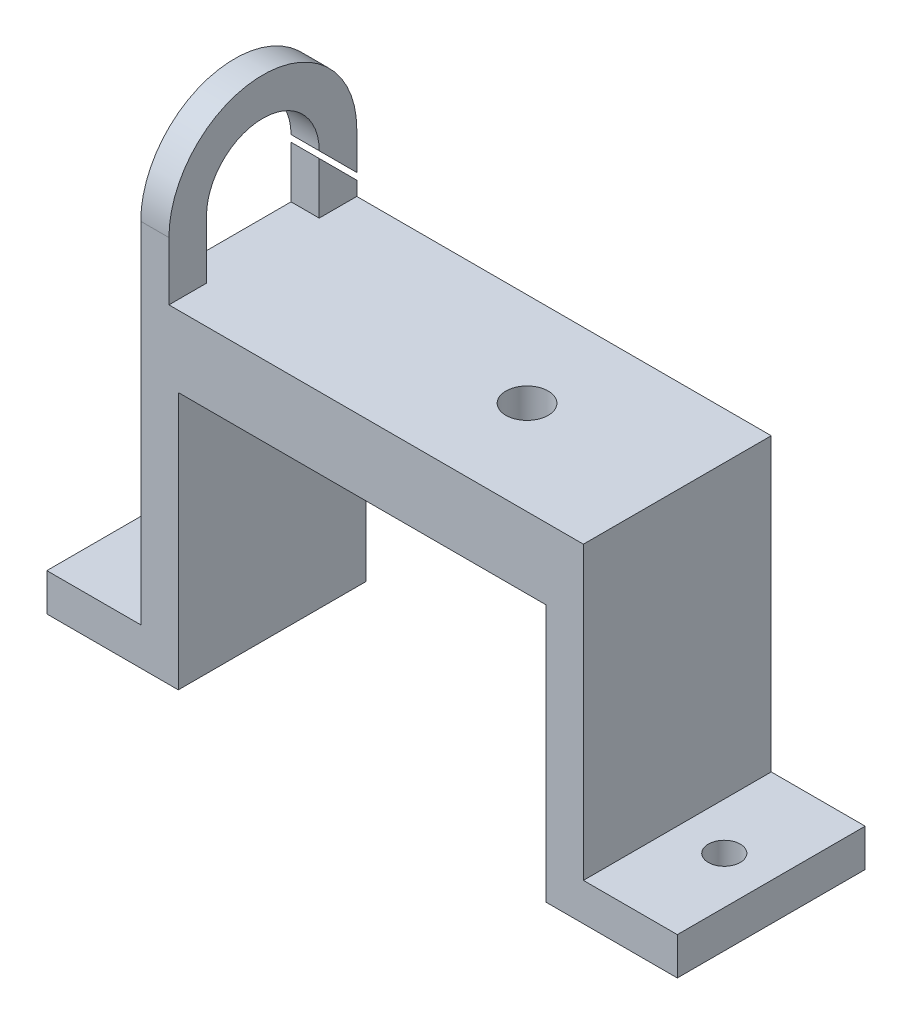
ISO-10303-21;
HEADER;
FILE_DESCRIPTION(('STEP AP214'),'2;1');
FILE_NAME('part.step','',(''),(''),'','','');
FILE_SCHEMA(('AUTOMOTIVE_DESIGN { 1 0 10303 214 1 1 1 1 }'));
ENDSEC;
DATA;
#1=APPLICATION_CONTEXT('core data for automotive mechanical design processes');
#2=APPLICATION_PROTOCOL_DEFINITION('international standard','automotive_design',2000,#1);
#3=PRODUCT_CONTEXT('',#1,'mechanical');
#4=PRODUCT('Part','Part','',(#3));
#5=PRODUCT_RELATED_PRODUCT_CATEGORY('part','',(#4));
#6=PRODUCT_DEFINITION_FORMATION('','',#4);
#7=PRODUCT_DEFINITION_CONTEXT('part definition',#1,'design');
#8=PRODUCT_DEFINITION('design','',#6,#7);
#9=PRODUCT_DEFINITION_SHAPE('','',#8);
#10=(LENGTH_UNIT() NAMED_UNIT(*) SI_UNIT(.MILLI.,.METRE.));
#11=(NAMED_UNIT(*) PLANE_ANGLE_UNIT() SI_UNIT($,.RADIAN.));
#12=(NAMED_UNIT(*) SI_UNIT($,.STERADIAN.) SOLID_ANGLE_UNIT());
#13=UNCERTAINTY_MEASURE_WITH_UNIT(LENGTH_MEASURE(1.E-05),#10,'distance_accuracy_value','');
#14=(GEOMETRIC_REPRESENTATION_CONTEXT(3) GLOBAL_UNCERTAINTY_ASSIGNED_CONTEXT((#13)) GLOBAL_UNIT_ASSIGNED_CONTEXT((#10,
#11,#12)) REPRESENTATION_CONTEXT('',''));
#15=CARTESIAN_POINT('',(0.,0.,0.));
#16=DIRECTION('',(0.,0.,1.));
#17=DIRECTION('',(1.,0.,0.));
#18=AXIS2_PLACEMENT_3D('',#15,#16,#17);
#19=CARTESIAN_POINT('',(-19.5635,0.,10.));
#20=DIRECTION('',(-1.,0.,0.));
#21=DIRECTION('',(0.,-1.,0.));
#22=AXIS2_PLACEMENT_3D('',#19,#20,#21);
#23=PLANE('',#22);
#24=DIRECTION('',(0.,1.,0.));
#25=VECTOR('',#24,1.);
#26=CARTESIAN_POINT('',(-19.5635,0.,-10.));
#27=LINE('',#26,#25);
#28=CARTESIAN_POINT('',(-19.5635,-31.,-10.));
#29=VERTEX_POINT('',#28);
#30=CARTESIAN_POINT('',(-19.5635,-3.58190647636204,-10.));
#31=VERTEX_POINT('',#30);
#32=EDGE_CURVE('E320',#29,#31,#27,.T.);
#33=ORIENTED_EDGE('',*,*,#32,.T.);
#34=CARTESIAN_POINT('',(-19.5635,-15.75,0.));
#35=DIRECTION('',(-1.,0.,0.));
#36=DIRECTION('',(0.,-1.,0.));
#37=AXIS2_PLACEMENT_3D('',#34,#35,#36);
#38=CIRCLE('',#37,15.75);
#39=CARTESIAN_POINT('',(-19.5635,-3.58190647636204,10.));
#40=VERTEX_POINT('',#39);
#41=EDGE_CURVE('E68',#40,#31,#38,.T.);
#42=ORIENTED_EDGE('',*,*,#41,.F.);
#43=DIRECTION('',(0.,1.,0.));
#44=VECTOR('',#43,1.);
#45=CARTESIAN_POINT('',(-19.5635,0.,10.));
#46=LINE('',#45,#44);
#47=CARTESIAN_POINT('',(-19.5635,-31.,10.));
#48=VERTEX_POINT('',#47);
#49=EDGE_CURVE('E295',#48,#40,#46,.T.);
#50=ORIENTED_EDGE('',*,*,#49,.F.);
#51=DIRECTION('',(0.,0.,-1.));
#52=VECTOR('',#51,1.);
#53=CARTESIAN_POINT('',(-19.5635,-31.,10.));
#54=LINE('',#53,#52);
#55=EDGE_CURVE('E53',#48,#29,#54,.T.);
#56=ORIENTED_EDGE('',*,*,#55,.T.);
#57=EDGE_LOOP('',(#33,#42,#50,#56));
#58=FACE_BOUND('',#57,.T.);
#59=ADVANCED_FACE('F39',(#58),#23,.F.);
#60=CARTESIAN_POINT('',(19.5635,0.,10.));
#61=DIRECTION('',(1.,0.,0.));
#62=DIRECTION('',(0.,1.,0.));
#63=AXIS2_PLACEMENT_3D('',#60,#61,#62);
#64=PLANE('',#63);
#65=CARTESIAN_POINT('',(19.5635,-15.75,0.));
#66=DIRECTION('',(1.,0.,0.));
#67=DIRECTION('',(0.,1.,0.));
#68=AXIS2_PLACEMENT_3D('',#65,#66,#67);
#69=CIRCLE('',#68,15.75);
#70=CARTESIAN_POINT('',(19.5635,-3.58190647636204,10.));
#71=VERTEX_POINT('',#70);
#72=CARTESIAN_POINT('',(19.5635,-3.58190647636204,-10.));
#73=VERTEX_POINT('',#72);
#74=EDGE_CURVE('E285',#71,#73,#69,.F.);
#75=ORIENTED_EDGE('',*,*,#74,.T.);
#76=DIRECTION('',(0.,-1.,0.));
#77=VECTOR('',#76,1.);
#78=CARTESIAN_POINT('',(19.5635,0.,-10.));
#79=LINE('',#78,#77);
#80=CARTESIAN_POINT('',(19.5635,-31.,-10.));
#81=VERTEX_POINT('',#80);
#82=EDGE_CURVE('E322',#73,#81,#79,.T.);
#83=ORIENTED_EDGE('',*,*,#82,.T.);
#84=DIRECTION('',(0.,0.,-1.));
#85=VECTOR('',#84,1.);
#86=CARTESIAN_POINT('',(19.5635,-31.,10.));
#87=LINE('',#86,#85);
#88=CARTESIAN_POINT('',(19.5635,-31.,10.));
#89=VERTEX_POINT('',#88);
#90=EDGE_CURVE('E356',#89,#81,#87,.T.);
#91=ORIENTED_EDGE('',*,*,#90,.F.);
#92=DIRECTION('',(0.,-1.,0.));
#93=VECTOR('',#92,1.);
#94=CARTESIAN_POINT('',(19.5635,0.,10.));
#95=LINE('',#94,#93);
#96=EDGE_CURVE('E298',#71,#89,#95,.T.);
#97=ORIENTED_EDGE('',*,*,#96,.F.);
#98=EDGE_LOOP('',(#75,#83,#91,#97));
#99=FACE_BOUND('',#98,.T.);
#100=ADVANCED_FACE('F377',(#99),#64,.F.);
#101=CARTESIAN_POINT('',(-33.5635,-31.,10.));
#102=DIRECTION('',(1.,0.,0.));
#103=DIRECTION('',(0.,0.,-1.));
#104=AXIS2_PLACEMENT_3D('',#101,#102,#103);
#105=PLANE('',#104);
#106=DIRECTION('',(0.,-1.,0.));
#107=VECTOR('',#106,1.);
#108=CARTESIAN_POINT('',(-33.5635,-31.,-10.));
#109=LINE('',#108,#107);
#110=CARTESIAN_POINT('',(-33.5635,-27.,-10.));
#111=VERTEX_POINT('',#110);
#112=CARTESIAN_POINT('',(-33.5635,-31.,-10.));
#113=VERTEX_POINT('',#112);
#114=EDGE_CURVE('E287',#111,#113,#109,.T.);
#115=ORIENTED_EDGE('',*,*,#114,.T.);
#116=DIRECTION('',(0.,0.,-1.));
#117=VECTOR('',#116,1.);
#118=CARTESIAN_POINT('',(-33.5635,-31.,10.));
#119=LINE('',#118,#117);
#120=CARTESIAN_POINT('',(-33.5635,-31.,10.));
#121=VERTEX_POINT('',#120);
#122=EDGE_CURVE('E11',#121,#113,#119,.T.);
#123=ORIENTED_EDGE('',*,*,#122,.F.);
#124=DIRECTION('',(0.,-1.,0.));
#125=VECTOR('',#124,1.);
#126=CARTESIAN_POINT('',(-33.5635,-31.,10.));
#127=LINE('',#126,#125);
#128=CARTESIAN_POINT('',(-33.5635,-27.,10.));
#129=VERTEX_POINT('',#128);
#130=EDGE_CURVE('E289',#129,#121,#127,.T.);
#131=ORIENTED_EDGE('',*,*,#130,.F.);
#132=DIRECTION('',(0.,0.,-1.));
#133=VECTOR('',#132,1.);
#134=CARTESIAN_POINT('',(-33.5635,-27.,10.));
#135=LINE('',#134,#133);
#136=EDGE_CURVE('E315',#129,#111,#135,.T.);
#137=ORIENTED_EDGE('',*,*,#136,.T.);
#138=EDGE_LOOP('',(#115,#123,#131,#137));
#139=FACE_BOUND('',#138,.T.);
#140=ADVANCED_FACE('F41',(#139),#105,.F.);
#141=CARTESIAN_POINT('',(-19.5635,-31.,10.));
#142=DIRECTION('',(0.,1.,0.));
#143=DIRECTION('',(-1.,0.,0.));
#144=AXIS2_PLACEMENT_3D('',#141,#142,#143);
#145=PLANE('',#144);
#146=CARTESIAN_POINT('',(-28.5635,-31.,0.));
#147=DIRECTION('',(0.,1.,0.));
#148=DIRECTION('',(-1.,0.,0.));
#149=AXIS2_PLACEMENT_3D('',#146,#147,#148);
#150=CIRCLE('',#149,1.69999999999999);
#151=CARTESIAN_POINT('',(-30.2635,-31.,0.));
#152=VERTEX_POINT('',#151);
#153=EDGE_CURVE('E277',#152,#152,#150,.T.);
#154=ORIENTED_EDGE('',*,*,#153,.T.);
#155=EDGE_LOOP('',(#154));
#156=FACE_BOUND('',#155,.T.);
#157=DIRECTION('',(1.,0.,0.));
#158=VECTOR('',#157,1.);
#159=CARTESIAN_POINT('',(-19.5635,-31.,-10.));
#160=LINE('',#159,#158);
#161=EDGE_CURVE('E318',#113,#29,#160,.T.);
#162=ORIENTED_EDGE('',*,*,#161,.T.);
#163=ORIENTED_EDGE('',*,*,#55,.F.);
#164=DIRECTION('',(1.,0.,0.));
#165=VECTOR('',#164,1.);
#166=CARTESIAN_POINT('',(-19.5635,-31.,10.));
#167=LINE('',#166,#165);
#168=EDGE_CURVE('E292',#121,#48,#167,.T.);
#169=ORIENTED_EDGE('',*,*,#168,.F.);
#170=ORIENTED_EDGE('',*,*,#122,.T.);
#171=EDGE_LOOP('',(#162,#163,#169,#170));
#172=FACE_BOUND('',#171,.T.);
#173=ADVANCED_FACE('F431',(#156,#172),#145,.F.);
#174=CARTESIAN_POINT('',(33.5635,-31.,10.));
#175=DIRECTION('',(0.,1.,0.));
#176=DIRECTION('',(-1.,0.,0.));
#177=AXIS2_PLACEMENT_3D('',#174,#175,#176);
#178=PLANE('',#177);
#179=CARTESIAN_POINT('',(28.5635,-31.,0.));
#180=DIRECTION('',(0.,1.,0.));
#181=DIRECTION('',(-1.,0.,0.));
#182=AXIS2_PLACEMENT_3D('',#179,#180,#181);
#183=CIRCLE('',#182,1.69999999999999);
#184=CARTESIAN_POINT('',(26.8635,-31.,0.));
#185=VERTEX_POINT('',#184);
#186=EDGE_CURVE('E271',#185,#185,#183,.T.);
#187=ORIENTED_EDGE('',*,*,#186,.T.);
#188=EDGE_LOOP('',(#187));
#189=FACE_BOUND('',#188,.T.);
#190=DIRECTION('',(1.,0.,0.));
#191=VECTOR('',#190,1.);
#192=CARTESIAN_POINT('',(33.5635,-31.,-10.));
#193=LINE('',#192,#191);
#194=CARTESIAN_POINT('',(33.5635,-31.,-10.));
#195=VERTEX_POINT('',#194);
#196=EDGE_CURVE('E324',#81,#195,#193,.T.);
#197=ORIENTED_EDGE('',*,*,#196,.T.);
#198=DIRECTION('',(0.,0.,-1.));
#199=VECTOR('',#198,1.);
#200=CARTESIAN_POINT('',(33.5635,-31.,10.));
#201=LINE('',#200,#199);
#202=CARTESIAN_POINT('',(33.5635,-31.,10.));
#203=VERTEX_POINT('',#202);
#204=EDGE_CURVE('E353',#203,#195,#201,.T.);
#205=ORIENTED_EDGE('',*,*,#204,.F.);
#206=DIRECTION('',(1.,0.,0.));
#207=VECTOR('',#206,1.);
#208=CARTESIAN_POINT('',(33.5635,-31.,10.));
#209=LINE('',#208,#207);
#210=EDGE_CURVE('E300',#89,#203,#209,.T.);
#211=ORIENTED_EDGE('',*,*,#210,.F.);
#212=ORIENTED_EDGE('',*,*,#90,.T.);
#213=EDGE_LOOP('',(#197,#205,#211,#212));
#214=FACE_BOUND('',#213,.T.);
#215=ADVANCED_FACE('F381',(#189,#214),#178,.F.);
#216=CARTESIAN_POINT('',(33.5635,-27.,10.));
#217=DIRECTION('',(-1.,0.,0.));
#218=DIRECTION('',(0.,0.,1.));
#219=AXIS2_PLACEMENT_3D('',#216,#217,#218);
#220=PLANE('',#219);
#221=DIRECTION('',(0.,1.,0.));
#222=VECTOR('',#221,1.);
#223=CARTESIAN_POINT('',(33.5635,-27.,-10.));
#224=LINE('',#223,#222);
#225=CARTESIAN_POINT('',(33.5635,-27.,-10.));
#226=VERTEX_POINT('',#225);
#227=EDGE_CURVE('E326',#195,#226,#224,.T.);
#228=ORIENTED_EDGE('',*,*,#227,.T.);
#229=DIRECTION('',(0.,0.,-1.));
#230=VECTOR('',#229,1.);
#231=CARTESIAN_POINT('',(33.5635,-27.,10.));
#232=LINE('',#231,#230);
#233=CARTESIAN_POINT('',(33.5635,-27.,10.));
#234=VERTEX_POINT('',#233);
#235=EDGE_CURVE('E350',#234,#226,#232,.T.);
#236=ORIENTED_EDGE('',*,*,#235,.F.);
#237=DIRECTION('',(0.,1.,0.));
#238=VECTOR('',#237,1.);
#239=CARTESIAN_POINT('',(33.5635,-27.,10.));
#240=LINE('',#239,#238);
#241=EDGE_CURVE('E302',#203,#234,#240,.T.);
#242=ORIENTED_EDGE('',*,*,#241,.F.);
#243=ORIENTED_EDGE('',*,*,#204,.T.);
#244=EDGE_LOOP('',(#228,#236,#242,#243));
#245=FACE_BOUND('',#244,.T.);
#246=ADVANCED_FACE('F387',(#245),#220,.F.);
#247=CARTESIAN_POINT('',(23.5635,-27.,10.));
#248=DIRECTION('',(0.,-1.,0.));
#249=DIRECTION('',(0.,0.,-1.));
#250=AXIS2_PLACEMENT_3D('',#247,#248,#249);
#251=PLANE('',#250);
#252=CARTESIAN_POINT('',(28.5635,-27.,0.));
#253=DIRECTION('',(0.,1.,0.));
#254=DIRECTION('',(0.,0.,1.));
#255=AXIS2_PLACEMENT_3D('',#252,#253,#254);
#256=CIRCLE('',#255,1.69999999999999);
#257=CARTESIAN_POINT('',(28.5635,-27.,1.69999999999999));
#258=VERTEX_POINT('',#257);
#259=EDGE_CURVE('E268',#258,#258,#256,.T.);
#260=ORIENTED_EDGE('',*,*,#259,.F.);
#261=EDGE_LOOP('',(#260));
#262=FACE_BOUND('',#261,.T.);
#263=DIRECTION('',(-1.,0.,0.));
#264=VECTOR('',#263,1.);
#265=CARTESIAN_POINT('',(23.5635,-27.,-10.));
#266=LINE('',#265,#264);
#267=CARTESIAN_POINT('',(23.5635,-27.,-10.));
#268=VERTEX_POINT('',#267);
#269=EDGE_CURVE('E328',#226,#268,#266,.T.);
#270=ORIENTED_EDGE('',*,*,#269,.T.);
#271=DIRECTION('',(0.,0.,-1.));
#272=VECTOR('',#271,1.);
#273=CARTESIAN_POINT('',(23.5635,-27.,10.));
#274=LINE('',#273,#272);
#275=CARTESIAN_POINT('',(23.5635,-27.,10.));
#276=VERTEX_POINT('',#275);
#277=EDGE_CURVE('E347',#276,#268,#274,.T.);
#278=ORIENTED_EDGE('',*,*,#277,.F.);
#279=DIRECTION('',(-1.,0.,0.));
#280=VECTOR('',#279,1.);
#281=CARTESIAN_POINT('',(23.5635,-27.,10.));
#282=LINE('',#281,#280);
#283=EDGE_CURVE('E304',#234,#276,#282,.T.);
#284=ORIENTED_EDGE('',*,*,#283,.F.);
#285=ORIENTED_EDGE('',*,*,#235,.T.);
#286=EDGE_LOOP('',(#270,#278,#284,#285));
#287=FACE_BOUND('',#286,.T.);
#288=ADVANCED_FACE('F391',(#262,#287),#251,.F.);
#289=CARTESIAN_POINT('',(23.5635,4.,10.));
#290=DIRECTION('',(-1.,0.,0.));
#291=DIRECTION('',(0.,-1.,0.));
#292=AXIS2_PLACEMENT_3D('',#289,#290,#291);
#293=PLANE('',#292);
#294=DIRECTION('',(0.,1.,0.));
#295=VECTOR('',#294,1.);
#296=CARTESIAN_POINT('',(23.5635,4.,-10.));
#297=LINE('',#296,#295);
#298=CARTESIAN_POINT('',(23.5635,4.,-10.));
#299=VERTEX_POINT('',#298);
#300=EDGE_CURVE('E330',#268,#299,#297,.T.);
#301=ORIENTED_EDGE('',*,*,#300,.T.);
#302=DIRECTION('',(0.,0.,-1.));
#303=VECTOR('',#302,1.);
#304=CARTESIAN_POINT('',(23.5635,4.,10.));
#305=LINE('',#304,#303);
#306=CARTESIAN_POINT('',(23.5635,4.,10.));
#307=VERTEX_POINT('',#306);
#308=EDGE_CURVE('E344',#307,#299,#305,.T.);
#309=ORIENTED_EDGE('',*,*,#308,.F.);
#310=DIRECTION('',(0.,1.,0.));
#311=VECTOR('',#310,1.);
#312=CARTESIAN_POINT('',(23.5635,4.,10.));
#313=LINE('',#312,#311);
#314=EDGE_CURVE('E306',#276,#307,#313,.T.);
#315=ORIENTED_EDGE('',*,*,#314,.F.);
#316=ORIENTED_EDGE('',*,*,#277,.T.);
#317=EDGE_LOOP('',(#301,#309,#315,#316));
#318=FACE_BOUND('',#317,.T.);
#319=ADVANCED_FACE('F396',(#318),#293,.F.);
#320=CARTESIAN_POINT('',(-23.5635,4.,10.));
#321=DIRECTION('',(0.,-1.,0.));
#322=DIRECTION('',(0.,0.,-1.));
#323=AXIS2_PLACEMENT_3D('',#320,#321,#322);
#324=PLANE('',#323);
#325=CARTESIAN_POINT('',(7.5635,4.,0.));
#326=DIRECTION('',(0.,1.,0.));
#327=DIRECTION('',(0.,0.,1.));
#328=AXIS2_PLACEMENT_3D('',#325,#326,#327);
#329=CIRCLE('',#328,2.24999999999999);
#330=CARTESIAN_POINT('',(7.5635,4.,2.24999999999999));
#331=VERTEX_POINT('',#330);
#332=EDGE_CURVE('E261',#331,#331,#329,.T.);
#333=ORIENTED_EDGE('',*,*,#332,.F.);
#334=EDGE_LOOP('',(#333));
#335=FACE_BOUND('',#334,.T.);
#336=DIRECTION('',(0.,0.,-1.));
#337=VECTOR('',#336,1.);
#338=CARTESIAN_POINT('',(-23.5635,4.,10.));
#339=LINE('',#338,#337);
#340=CARTESIAN_POINT('',(-23.5635,4.,6.));
#341=VERTEX_POINT('',#340);
#342=CARTESIAN_POINT('',(-23.5635,4.,-6.));
#343=VERTEX_POINT('',#342);
#344=EDGE_CURVE('E60',#341,#343,#339,.T.);
#345=ORIENTED_EDGE('',*,*,#344,.F.);
#346=DIRECTION('',(-1.,0.,0.));
#347=VECTOR('',#346,1.);
#348=CARTESIAN_POINT('',(-20.5635,4.,6.));
#349=LINE('',#348,#347);
#350=CARTESIAN_POINT('',(-20.5635,4.,6.));
#351=VERTEX_POINT('',#350);
#352=EDGE_CURVE('E206',#351,#341,#349,.T.);
#353=ORIENTED_EDGE('',*,*,#352,.F.);
#354=DIRECTION('',(0.,0.,1.));
#355=VECTOR('',#354,1.);
#356=CARTESIAN_POINT('',(-20.5635,4.,10.));
#357=LINE('',#356,#355);
#358=CARTESIAN_POINT('',(-20.5635,4.,10.));
#359=VERTEX_POINT('',#358);
#360=EDGE_CURVE('E219',#351,#359,#357,.T.);
#361=ORIENTED_EDGE('',*,*,#360,.T.);
#362=DIRECTION('',(-1.,0.,0.));
#363=VECTOR('',#362,1.);
#364=CARTESIAN_POINT('',(-23.5635,4.,10.));
#365=LINE('',#364,#363);
#366=EDGE_CURVE('E308',#307,#359,#365,.T.);
#367=ORIENTED_EDGE('',*,*,#366,.F.);
#368=ORIENTED_EDGE('',*,*,#308,.T.);
#369=DIRECTION('',(-1.,0.,0.));
#370=VECTOR('',#369,1.);
#371=CARTESIAN_POINT('',(-23.5635,4.,-10.));
#372=LINE('',#371,#370);
#373=CARTESIAN_POINT('',(-20.5635,4.,-10.));
#374=VERTEX_POINT('',#373);
#375=EDGE_CURVE('E332',#299,#374,#372,.T.);
#376=ORIENTED_EDGE('',*,*,#375,.T.);
#377=DIRECTION('',(0.,0.,1.));
#378=VECTOR('',#377,1.);
#379=CARTESIAN_POINT('',(-20.5635,4.,-6.));
#380=LINE('',#379,#378);
#381=CARTESIAN_POINT('',(-20.5635,4.,-6.));
#382=VERTEX_POINT('',#381);
#383=EDGE_CURVE('E241',#374,#382,#380,.T.);
#384=ORIENTED_EDGE('',*,*,#383,.T.);
#385=DIRECTION('',(-1.,0.,0.));
#386=VECTOR('',#385,1.);
#387=CARTESIAN_POINT('',(-20.5635,4.,-6.));
#388=LINE('',#387,#386);
#389=EDGE_CURVE('E254',#382,#343,#388,.T.);
#390=ORIENTED_EDGE('',*,*,#389,.T.);
#391=EDGE_LOOP('',(#345,#353,#361,#367,#368,#376,#384,#390));
#392=FACE_BOUND('',#391,.T.);
#393=ADVANCED_FACE('F400',(#335,#392),#324,.F.);
#394=CARTESIAN_POINT('',(-23.5635,-27.,10.));
#395=DIRECTION('',(1.,0.,0.));
#396=DIRECTION('',(0.,1.,0.));
#397=AXIS2_PLACEMENT_3D('',#394,#395,#396);
#398=PLANE('',#397);
#399=DIRECTION('',(0.,-1.,0.));
#400=VECTOR('',#399,1.);
#401=CARTESIAN_POINT('',(-23.5635,-27.,-10.));
#402=LINE('',#401,#400);
#403=CARTESIAN_POINT('',(-23.5635,5.5,-10.));
#404=VERTEX_POINT('',#403);
#405=CARTESIAN_POINT('',(-23.5635,-27.,-10.));
#406=VERTEX_POINT('',#405);
#407=EDGE_CURVE('E335',#404,#406,#402,.T.);
#408=ORIENTED_EDGE('',*,*,#407,.T.);
#409=DIRECTION('',(0.,0.,-1.));
#410=VECTOR('',#409,1.);
#411=CARTESIAN_POINT('',(-23.5635,-27.,10.));
#412=LINE('',#411,#410);
#413=CARTESIAN_POINT('',(-23.5635,-27.,10.));
#414=VERTEX_POINT('',#413);
#415=EDGE_CURVE('E340',#414,#406,#412,.T.);
#416=ORIENTED_EDGE('',*,*,#415,.F.);
#417=DIRECTION('',(0.,-1.,0.));
#418=VECTOR('',#417,1.);
#419=CARTESIAN_POINT('',(-23.5635,-27.,10.));
#420=LINE('',#419,#418);
#421=CARTESIAN_POINT('',(-23.5635,10.2071067811866,9.99999999999999));
#422=VERTEX_POINT('',#421);
#423=EDGE_CURVE('E311',#422,#414,#420,.T.);
#424=ORIENTED_EDGE('',*,*,#423,.F.);
#425=CARTESIAN_POINT('',(-23.5635,10.2071067811866,0.));
#426=DIRECTION('',(-1.,0.,0.));
#427=DIRECTION('',(0.,-1.,0.));
#428=AXIS2_PLACEMENT_3D('',#425,#426,#427);
#429=CIRCLE('',#428,9.99999999999999);
#430=CARTESIAN_POINT('',(-23.5635,10.2071067811866,-9.99999999999999));
#431=VERTEX_POINT('',#430);
#432=EDGE_CURVE('E208',#422,#431,#429,.T.);
#433=ORIENTED_EDGE('',*,*,#432,.T.);
#434=DIRECTION('',(0.,-1.,0.));
#435=VECTOR('',#434,1.);
#436=CARTESIAN_POINT('',(-23.5635,6.20710678118655,-10.));
#437=LINE('',#436,#435);
#438=CARTESIAN_POINT('',(-23.5635,6.20710678118655,-10.));
#439=VERTEX_POINT('',#438);
#440=EDGE_CURVE('E217',#431,#439,#437,.T.);
#441=ORIENTED_EDGE('',*,*,#440,.T.);
#442=DIRECTION('',(0.,0.707106781186551,0.707106781186544));
#443=VECTOR('',#442,1.);
#444=CARTESIAN_POINT('',(-23.5635,6.20710678118655,-10.));
#445=LINE('',#444,#443);
#446=CARTESIAN_POINT('',(-23.5635,10.2071067811866,-6.));
#447=VERTEX_POINT('',#446);
#448=EDGE_CURVE('E214',#439,#447,#445,.T.);
#449=ORIENTED_EDGE('',*,*,#448,.T.);
#450=CARTESIAN_POINT('',(-23.5635,10.2071067811866,0.));
#451=DIRECTION('',(1.,0.,0.));
#452=DIRECTION('',(0.,-1.,0.));
#453=AXIS2_PLACEMENT_3D('',#450,#451,#452);
#454=CIRCLE('',#453,6.);
#455=CARTESIAN_POINT('',(-23.5635,10.2071067811866,6.));
#456=VERTEX_POINT('',#455);
#457=EDGE_CURVE('E195',#447,#456,#454,.T.);
#458=ORIENTED_EDGE('',*,*,#457,.T.);
#459=DIRECTION('',(0.,-1.,0.));
#460=VECTOR('',#459,1.);
#461=CARTESIAN_POINT('',(-23.5635,4.,6.));
#462=LINE('',#461,#460);
#463=EDGE_CURVE('E203',#456,#341,#462,.T.);
#464=ORIENTED_EDGE('',*,*,#463,.T.);
#465=ORIENTED_EDGE('',*,*,#344,.T.);
#466=DIRECTION('',(0.,1.,0.));
#467=VECTOR('',#466,1.);
#468=CARTESIAN_POINT('',(-23.5635,9.50000000000004,-6.));
#469=LINE('',#468,#467);
#470=CARTESIAN_POINT('',(-23.5635,9.50000000000004,-6.));
#471=VERTEX_POINT('',#470);
#472=EDGE_CURVE('E207',#343,#471,#469,.T.);
#473=ORIENTED_EDGE('',*,*,#472,.T.);
#474=DIRECTION('',(0.,-0.707106781186552,-0.707106781186544));
#475=VECTOR('',#474,1.);
#476=CARTESIAN_POINT('',(-23.5635,5.5,-10.));
#477=LINE('',#476,#475);
#478=EDGE_CURVE('E245',#471,#404,#477,.T.);
#479=ORIENTED_EDGE('',*,*,#478,.T.);
#480=EDGE_LOOP('',(#408,#416,#424,#433,#441,#449,#458,#464,#465,#473,#479));
#481=FACE_BOUND('',#480,.T.);
#482=ADVANCED_FACE('F211',(#481),#398,.F.);
#483=CARTESIAN_POINT('',(-33.5635,-27.,10.));
#484=DIRECTION('',(0.,-1.,0.));
#485=DIRECTION('',(0.,0.,-1.));
#486=AXIS2_PLACEMENT_3D('',#483,#484,#485);
#487=PLANE('',#486);
#488=CARTESIAN_POINT('',(-28.5635,-27.,0.));
#489=DIRECTION('',(0.,1.,0.));
#490=DIRECTION('',(0.,0.,1.));
#491=AXIS2_PLACEMENT_3D('',#488,#489,#490);
#492=CIRCLE('',#491,1.69999999999999);
#493=CARTESIAN_POINT('',(-28.5635,-27.,1.69999999999999));
#494=VERTEX_POINT('',#493);
#495=EDGE_CURVE('E274',#494,#494,#492,.T.);
#496=ORIENTED_EDGE('',*,*,#495,.F.);
#497=EDGE_LOOP('',(#496));
#498=FACE_BOUND('',#497,.T.);
#499=DIRECTION('',(-1.,0.,0.));
#500=VECTOR('',#499,1.);
#501=CARTESIAN_POINT('',(-33.5635,-27.,-10.));
#502=LINE('',#501,#500);
#503=EDGE_CURVE('E293',#406,#111,#502,.T.);
#504=ORIENTED_EDGE('',*,*,#503,.T.);
#505=ORIENTED_EDGE('',*,*,#136,.F.);
#506=DIRECTION('',(-1.,0.,0.));
#507=VECTOR('',#506,1.);
#508=CARTESIAN_POINT('',(-33.5635,-27.,10.));
#509=LINE('',#508,#507);
#510=EDGE_CURVE('E313',#414,#129,#509,.T.);
#511=ORIENTED_EDGE('',*,*,#510,.F.);
#512=ORIENTED_EDGE('',*,*,#415,.T.);
#513=EDGE_LOOP('',(#504,#505,#511,#512));
#514=FACE_BOUND('',#513,.T.);
#515=ADVANCED_FACE('F428',(#498,#514),#487,.F.);
#516=CARTESIAN_POINT('',(0.,0.,10.));
#517=DIRECTION('',(0.,0.,-1.));
#518=DIRECTION('',(-1.,0.,0.));
#519=AXIS2_PLACEMENT_3D('',#516,#517,#518);
#520=PLANE('',#519);
#521=ORIENTED_EDGE('',*,*,#49,.T.);
#522=DIRECTION('',(-1.,0.,0.));
#523=VECTOR('',#522,1.);
#524=CARTESIAN_POINT('',(30.1856492178092,-3.58190647636204,10.));
#525=LINE('',#524,#523);
#526=EDGE_CURVE('E283',#71,#40,#525,.T.);
#527=ORIENTED_EDGE('',*,*,#526,.F.);
#528=ORIENTED_EDGE('',*,*,#96,.T.);
#529=ORIENTED_EDGE('',*,*,#210,.T.);
#530=ORIENTED_EDGE('',*,*,#241,.T.);
#531=ORIENTED_EDGE('',*,*,#283,.T.);
#532=ORIENTED_EDGE('',*,*,#314,.T.);
#533=ORIENTED_EDGE('',*,*,#366,.T.);
#534=DIRECTION('',(0.,1.,0.));
#535=VECTOR('',#534,1.);
#536=CARTESIAN_POINT('',(-20.5635,4.,10.));
#537=LINE('',#536,#535);
#538=CARTESIAN_POINT('',(-20.5635,10.2071067811866,9.99999999999999));
#539=VERTEX_POINT('',#538);
#540=EDGE_CURVE('E236',#359,#539,#537,.T.);
#541=ORIENTED_EDGE('',*,*,#540,.T.);
#542=DIRECTION('',(-1.,0.,0.));
#543=VECTOR('',#542,1.);
#544=CARTESIAN_POINT('',(-20.5635,10.2071067811866,9.99999999999999));
#545=LINE('',#544,#543);
#546=EDGE_CURVE('E412',#539,#422,#545,.T.);
#547=ORIENTED_EDGE('',*,*,#546,.T.);
#548=ORIENTED_EDGE('',*,*,#423,.T.);
#549=ORIENTED_EDGE('',*,*,#510,.T.);
#550=ORIENTED_EDGE('',*,*,#130,.T.);
#551=ORIENTED_EDGE('',*,*,#168,.T.);
#552=EDGE_LOOP('',(#521,#527,#528,#529,#530,#531,#532,#533,#541,#547,#548,#549,#550,#551));
#553=FACE_BOUND('',#552,.T.);
#554=ADVANCED_FACE('F375',(#553),#520,.F.);
#555=CARTESIAN_POINT('',(0.,0.,-10.));
#556=DIRECTION('',(0.,0.,-1.));
#557=DIRECTION('',(-1.,0.,0.));
#558=AXIS2_PLACEMENT_3D('',#555,#556,#557);
#559=PLANE('',#558);
#560=DIRECTION('',(-1.,0.,0.));
#561=VECTOR('',#560,1.);
#562=CARTESIAN_POINT('',(30.1856492178092,-3.58190647636204,-10.));
#563=LINE('',#562,#561);
#564=EDGE_CURVE('E280',#73,#31,#563,.T.);
#565=ORIENTED_EDGE('',*,*,#564,.T.);
#566=ORIENTED_EDGE('',*,*,#32,.F.);
#567=ORIENTED_EDGE('',*,*,#161,.F.);
#568=ORIENTED_EDGE('',*,*,#114,.F.);
#569=ORIENTED_EDGE('',*,*,#503,.F.);
#570=ORIENTED_EDGE('',*,*,#407,.F.);
#571=DIRECTION('',(-1.,0.,0.));
#572=VECTOR('',#571,1.);
#573=CARTESIAN_POINT('',(-20.5635,5.5,-10.));
#574=LINE('',#573,#572);
#575=CARTESIAN_POINT('',(-20.5635,5.5,-10.));
#576=VERTEX_POINT('',#575);
#577=EDGE_CURVE('E258',#576,#404,#574,.T.);
#578=ORIENTED_EDGE('',*,*,#577,.F.);
#579=DIRECTION('',(0.,-1.,0.));
#580=VECTOR('',#579,1.);
#581=CARTESIAN_POINT('',(-20.5635,4.,-10.));
#582=LINE('',#581,#580);
#583=EDGE_CURVE('E251',#576,#374,#582,.T.);
#584=ORIENTED_EDGE('',*,*,#583,.T.);
#585=ORIENTED_EDGE('',*,*,#375,.F.);
#586=ORIENTED_EDGE('',*,*,#300,.F.);
#587=ORIENTED_EDGE('',*,*,#269,.F.);
#588=ORIENTED_EDGE('',*,*,#227,.F.);
#589=ORIENTED_EDGE('',*,*,#196,.F.);
#590=ORIENTED_EDGE('',*,*,#82,.F.);
#591=EDGE_LOOP('',(#565,#566,#567,#568,#569,#570,#578,#584,#585,#586,#587,#588,#589,#590));
#592=FACE_BOUND('',#591,.T.);
#593=ADVANCED_FACE('F366',(#592),#559,.T.);
#594=CARTESIAN_POINT('',(30.1856492178092,-15.75,0.));
#595=DIRECTION('',(-1.,0.,0.));
#596=DIRECTION('',(0.,0.,1.));
#597=AXIS2_PLACEMENT_3D('',#594,#595,#596);
#598=CYLINDRICAL_SURFACE('',#597,15.75);
#599=CARTESIAN_POINT('',(7.5635,-0.161542731880104,2.24999999999999));
#600=CARTESIAN_POINT('',(7.68918969264549,-0.161540710713376,2.24999475880481));
#601=CARTESIAN_POINT('',(7.81495405186889,-0.160006140302906,2.23943247570239));
#602=CARTESIAN_POINT('',(8.062971465976,-0.154037259785098,2.19747082655111));
#603=CARTESIAN_POINT('',(8.18522089495449,-0.149600060067279,2.16605069574415));
#604=CARTESIAN_POINT('',(8.42258228753252,-0.138338520262179,2.08332831191027));
#605=CARTESIAN_POINT('',(8.5376994628631,-0.131515948039257,2.03204078012339));
#606=CARTESIAN_POINT('',(8.75767594565154,-0.116254500771665,1.91107322875361));
#607=CARTESIAN_POINT('',(8.86253676542032,-0.107815864561834,1.84139592638314));
#608=CARTESIAN_POINT('',(9.05980433282824,-0.0902044658749352,1.6850851519522));
#609=CARTESIAN_POINT('',(9.15212567809912,-0.0810272871817662,1.59834438480745));
#610=CARTESIAN_POINT('',(9.32095425189565,-0.0630123399175619,1.41060046383803));
#611=CARTESIAN_POINT('',(9.3974606367203,-0.054174589474909,1.30959654958251));
#612=CARTESIAN_POINT('',(9.53280023497964,-0.037788333492474,1.09564918202305));
#613=CARTESIAN_POINT('',(9.59155517883323,-0.0302455991984204,0.9826557369931));
#614=CARTESIAN_POINT('',(9.68922207724379,-0.017348046154791,0.748278839208481));
#615=CARTESIAN_POINT('',(9.72813498497831,-0.011993122308992,0.626895789794243));
#616=CARTESIAN_POINT('',(9.78475535783479,-0.00410568739897775,0.380063321483568));
#617=CARTESIAN_POINT('',(9.80260557871201,-0.00155418392126425,0.254647265703612));
#618=CARTESIAN_POINT('',(9.81703688588742,0.000503949193084057,0.00257576093819841));
#619=CARTESIAN_POINT('',(9.81361904971187,1.07330876044046E-05,-0.124079624933152));
#620=CARTESIAN_POINT('',(9.7857244495072,-0.00394976853828998,-0.374061366209103));
#621=CARTESIAN_POINT('',(9.76140125125717,-0.00739536601018124,-0.497405249742413));
#622=CARTESIAN_POINT('',(9.69262712033838,-0.0168492891078588,-0.738242544519779));
#623=CARTESIAN_POINT('',(9.64817570938872,-0.0228576756297189,-0.855735816669617));
#624=CARTESIAN_POINT('',(9.54024791211848,-0.0367994208264517,-1.0820047126137));
#625=CARTESIAN_POINT('',(9.4767063299913,-0.0447393580682483,-1.19074881688995));
#626=CARTESIAN_POINT('',(9.3324494456672,-0.0616582496674304,-1.39608879765485));
#627=CARTESIAN_POINT('',(9.25173311677637,-0.0706372661255743,-1.4926839473383));
#628=CARTESIAN_POINT('',(9.0745610731145,-0.0887264443822163,-1.67188836494684));
#629=CARTESIAN_POINT('',(8.97797135065715,-0.097837061498667,-1.75436515498706));
#630=CARTESIAN_POINT('',(8.77225116339183,-0.115084193898776,-1.90195863288888));
#631=CARTESIAN_POINT('',(8.66312063433618,-0.123220704191564,-1.967075231807));
#632=CARTESIAN_POINT('',(8.43528467385554,-0.137598146067096,-2.07811464210893));
#633=CARTESIAN_POINT('',(8.31657296838207,-0.143837822588997,-2.1240247528325));
#634=CARTESIAN_POINT('',(8.07301522269588,-0.153692259649329,-2.1952195167186));
#635=CARTESIAN_POINT('',(7.94816957330949,-0.157307187193571,-2.2205054821534));
#636=CARTESIAN_POINT('',(7.6970638953912,-0.16147146648017,-2.24955439524217));
#637=CARTESIAN_POINT('',(7.57082597075497,-0.16204750646505,-2.2535047249253));
#638=CARTESIAN_POINT('',(7.31948996934671,-0.160139559006962,-2.2402665927801));
#639=CARTESIAN_POINT('',(7.1943918606988,-0.15765565740399,-2.2230787239379));
#640=CARTESIAN_POINT('',(6.949461297468,-0.149932164091908,-2.16821067587101));
#641=CARTESIAN_POINT('',(6.82960768205149,-0.144705022365935,-2.13062305324972));
#642=CARTESIAN_POINT('',(6.59790260286144,-0.132094223863083,-2.03611844442895));
#643=CARTESIAN_POINT('',(6.48605150049306,-0.124710469766882,-1.97920058591408));
#644=CARTESIAN_POINT('',(6.27268413531333,-0.108555205349051,-1.84719780372628));
#645=CARTESIAN_POINT('',(6.1712439186361,-0.0997745349115751,-1.77199110030515));
#646=CARTESIAN_POINT('',(5.98235781092131,-0.0818427277583317,-1.60571562549035));
#647=CARTESIAN_POINT('',(5.89491263593349,-0.0726915721168579,-1.51464604297743));
#648=CARTESIAN_POINT('',(5.73583037926198,-0.0549669103435107,-1.31840672207102));
#649=CARTESIAN_POINT('',(5.66431716239054,-0.0463982674291621,-1.21313606863986));
#650=CARTESIAN_POINT('',(5.53998999147232,-0.0308787574522115,-0.991967292867587));
#651=CARTESIAN_POINT('',(5.48717556529481,-0.0239278495445078,-0.876069438948507));
#652=CARTESIAN_POINT('',(5.40194512139483,-0.012448374250044,-0.637330415168169));
#653=CARTESIAN_POINT('',(5.36946021279408,-0.00791163385628444,-0.514514249014416));
#654=CARTESIAN_POINT('',(5.32558759950507,-0.00173745993904966,-0.265100916426504));
#655=CARTESIAN_POINT('',(5.31419863641443,-9.98534784769471E-05,-0.138503975978557));
#656=CARTESIAN_POINT('',(5.31286973118748,9.00863089570836E-05,0.113673521955551));
#657=CARTESIAN_POINT('',(5.32273982860425,-0.0013302559984474,0.239253099469398));
#658=CARTESIAN_POINT('',(5.36324316879844,-0.00704177690536259,0.486947962664865));
#659=CARTESIAN_POINT('',(5.39387636255444,-0.0113329487268792,0.609063256524907));
#660=CARTESIAN_POINT('',(5.47497122460666,-0.0223062518910688,0.84631917880937));
#661=CARTESIAN_POINT('',(5.52542095304507,-0.0289869432841644,0.961463958982725));
#662=CARTESIAN_POINT('',(5.64469679285256,-0.0440036988437881,1.18168391908305));
#663=CARTESIAN_POINT('',(5.71352338819139,-0.0523398066055717,1.28675883371286));
#664=CARTESIAN_POINT('',(5.86829117962528,-0.0698282160564019,1.48482219330249));
#665=CARTESIAN_POINT('',(5.95437302018274,-0.0789868591620156,1.57770018710799));
#666=CARTESIAN_POINT('',(6.14091225526854,-0.097039986379007,1.74776306318333));
#667=CARTESIAN_POINT('',(6.24137302588538,-0.105934407858783,1.8249442496026));
#668=CARTESIAN_POINT('',(6.45441361811545,-0.122500261953796,1.96176963909489));
#669=CARTESIAN_POINT('',(6.56705227666345,-0.130165268262204,2.02132298586273));
#670=CARTESIAN_POINT('',(6.80078633363081,-0.143329184510856,2.12057890318145));
#671=CARTESIAN_POINT('',(6.92187267309421,-0.14883037405086,2.16030237661865));
#672=CARTESIAN_POINT('',(7.13019097906593,-0.155752962392568,2.20960412061596));
#673=CARTESIAN_POINT('',(7.21612737733867,-0.157912830076429,2.22472982845811));
#674=CARTESIAN_POINT('',(7.38919722158478,-0.160808407734422,2.24492952947023));
#675=CARTESIAN_POINT('',(7.47633065417633,-0.161544133616219,2.25000363491663));
#676=CARTESIAN_POINT('',(7.5635,-0.161542731880104,2.24999999999999));
#677=B_SPLINE_CURVE_WITH_KNOTS('',3,(#599,#600,#601,#602,#603,#604,#605,#606,#607,#608,#609,
#610,#611,#612,#613,#614,#615,#616,#617,#618,#619,#620,#621,#622,#623,#624,#625,#626,#627,#628,
#629,#630,#631,#632,#633,#634,#635,#636,#637,#638,#639,#640,#641,#642,#643,#644,#645,#646,#647,
#648,#649,#650,#651,#652,#653,#654,#655,#656,#657,#658,#659,#660,#661,#662,#663,#664,#665,#666,
#667,#668,#669,#670,#671,#672,#673,#674,#675,#676),.UNSPECIFIED.,.T.,.F.,(4,2,2,2,2,2,2,2,2,2,2,
2,2,2,2,2,2,2,2,2,2,2,2,2,2,2,2,2,2,2,2,2,2,2,2,2,2,2,4),(0.,0.376750518085094,
0.753876668842064,1.13072391156778,1.50751550371846,1.88675680105146,2.26601832503853,
2.64692847010503,3.02782031517396,3.40611549905944,3.7843915171286,4.1599123302087,
4.53544206677674,4.91226916096558,5.28911878793667,5.66933082734521,6.0495448147006,
6.43000982997451,6.81045063514732,7.18754468717877,7.56462816089891,7.94001488404833,
8.31541854952263,8.69339386137893,9.07138850598673,9.45222661712434,9.83305511169361,
10.2125859990627,10.5920942461594,10.9682254721707,11.3443558101438,11.7202598688501,
12.0961738282723,12.4752864297224,12.8544881910558,13.2356116745463,13.6163325587673,
13.8776225846259,14.1389096918578),.UNSPECIFIED.);
#678=CARTESIAN_POINT('',(7.5635,-0.161542731880104,2.24999999999999));
#679=VERTEX_POINT('',#678);
#680=EDGE_CURVE('E43',#679,#679,#677,.T.);
#681=ORIENTED_EDGE('',*,*,#680,.T.);
#682=EDGE_LOOP('',(#681));
#683=FACE_BOUND('',#682,.T.);
#684=ORIENTED_EDGE('',*,*,#74,.F.);
#685=ORIENTED_EDGE('',*,*,#526,.T.);
#686=ORIENTED_EDGE('',*,*,#41,.T.);
#687=ORIENTED_EDGE('',*,*,#564,.F.);
#688=EDGE_LOOP('',(#684,#685,#686,#687));
#689=FACE_BOUND('',#688,.T.);
#690=ADVANCED_FACE('F370',(#683,#689),#598,.F.);
#691=CARTESIAN_POINT('',(-28.5635,-27.,0.));
#692=DIRECTION('',(0.,1.,0.));
#693=DIRECTION('',(0.,0.,1.));
#694=AXIS2_PLACEMENT_3D('',#691,#692,#693);
#695=CYLINDRICAL_SURFACE('',#694,1.69999999999999);
#696=ORIENTED_EDGE('',*,*,#495,.T.);
#697=EDGE_LOOP('',(#696));
#698=FACE_BOUND('',#697,.T.);
#699=ORIENTED_EDGE('',*,*,#153,.F.);
#700=EDGE_LOOP('',(#699));
#701=FACE_BOUND('',#700,.T.);
#702=ADVANCED_FACE('F468',(#698,#701),#695,.F.);
#703=CARTESIAN_POINT('',(28.5635,-27.,0.));
#704=DIRECTION('',(0.,1.,0.));
#705=DIRECTION('',(0.,0.,1.));
#706=AXIS2_PLACEMENT_3D('',#703,#704,#705);
#707=CYLINDRICAL_SURFACE('',#706,1.69999999999999);
#708=ORIENTED_EDGE('',*,*,#259,.T.);
#709=EDGE_LOOP('',(#708));
#710=FACE_BOUND('',#709,.T.);
#711=ORIENTED_EDGE('',*,*,#186,.F.);
#712=EDGE_LOOP('',(#711));
#713=FACE_BOUND('',#712,.T.);
#714=ADVANCED_FACE('F472',(#710,#713),#707,.F.);
#715=CARTESIAN_POINT('',(7.5635,4.,0.));
#716=DIRECTION('',(0.,1.,0.));
#717=DIRECTION('',(0.,0.,1.));
#718=AXIS2_PLACEMENT_3D('',#715,#716,#717);
#719=CYLINDRICAL_SURFACE('',#718,2.24999999999999);
#720=ORIENTED_EDGE('',*,*,#332,.T.);
#721=EDGE_LOOP('',(#720));
#722=FACE_BOUND('',#721,.T.);
#723=ORIENTED_EDGE('',*,*,#680,.F.);
#724=EDGE_LOOP('',(#723));
#725=FACE_BOUND('',#724,.T.);
#726=ADVANCED_FACE('F475',(#722,#725),#719,.F.);
#727=CARTESIAN_POINT('',(-20.5635,5.5,-10.));
#728=DIRECTION('',(0.,0.707106781186544,-0.707106781186551));
#729=DIRECTION('',(0.,0.707106781186551,0.707106781186544));
#730=AXIS2_PLACEMENT_3D('',#727,#728,#729);
#731=PLANE('',#730);
#732=ORIENTED_EDGE('',*,*,#478,.F.);
#733=DIRECTION('',(-1.,0.,0.));
#734=VECTOR('',#733,1.);
#735=CARTESIAN_POINT('',(-20.5635,9.50000000000004,-6.));
#736=LINE('',#735,#734);
#737=CARTESIAN_POINT('',(-20.5635,9.50000000000004,-6.));
#738=VERTEX_POINT('',#737);
#739=EDGE_CURVE('E262',#738,#471,#736,.T.);
#740=ORIENTED_EDGE('',*,*,#739,.F.);
#741=DIRECTION('',(0.,-0.707106781186552,-0.707106781186544));
#742=VECTOR('',#741,1.);
#743=CARTESIAN_POINT('',(-20.5635,5.5,-10.));
#744=LINE('',#743,#742);
#745=EDGE_CURVE('E248',#738,#576,#744,.T.);
#746=ORIENTED_EDGE('',*,*,#745,.T.);
#747=ORIENTED_EDGE('',*,*,#577,.T.);
#748=EDGE_LOOP('',(#732,#740,#746,#747));
#749=FACE_BOUND('',#748,.T.);
#750=ADVANCED_FACE('F480',(#749),#731,.T.);
#751=CARTESIAN_POINT('',(-20.5635,9.50000000000004,-6.));
#752=DIRECTION('',(0.,0.,1.));
#753=DIRECTION('',(1.,0.,0.));
#754=AXIS2_PLACEMENT_3D('',#751,#752,#753);
#755=PLANE('',#754);
#756=ORIENTED_EDGE('',*,*,#472,.F.);
#757=ORIENTED_EDGE('',*,*,#389,.F.);
#758=DIRECTION('',(0.,1.,0.));
#759=VECTOR('',#758,1.);
#760=CARTESIAN_POINT('',(-20.5635,9.50000000000004,-6.));
#761=LINE('',#760,#759);
#762=EDGE_CURVE('E244',#382,#738,#761,.T.);
#763=ORIENTED_EDGE('',*,*,#762,.T.);
#764=ORIENTED_EDGE('',*,*,#739,.T.);
#765=EDGE_LOOP('',(#756,#757,#763,#764));
#766=FACE_BOUND('',#765,.T.);
#767=ADVANCED_FACE('F482',(#766),#755,.T.);
#768=CARTESIAN_POINT('',(-20.5635,0.,0.));
#769=DIRECTION('',(1.,0.,0.));
#770=DIRECTION('',(0.,0.,-1.));
#771=AXIS2_PLACEMENT_3D('',#768,#769,#770);
#772=PLANE('',#771);
#773=ORIENTED_EDGE('',*,*,#383,.F.);
#774=ORIENTED_EDGE('',*,*,#583,.F.);
#775=ORIENTED_EDGE('',*,*,#745,.F.);
#776=ORIENTED_EDGE('',*,*,#762,.F.);
#777=EDGE_LOOP('',(#773,#774,#775,#776));
#778=FACE_BOUND('',#777,.T.);
#779=ADVANCED_FACE('F485',(#778),#772,.T.);
#780=CARTESIAN_POINT('',(-20.5635,4.,6.));
#781=DIRECTION('',(0.,0.,-1.));
#782=DIRECTION('',(0.,1.,0.));
#783=AXIS2_PLACEMENT_3D('',#780,#781,#782);
#784=PLANE('',#783);
#785=ORIENTED_EDGE('',*,*,#463,.F.);
#786=DIRECTION('',(-1.,0.,0.));
#787=VECTOR('',#786,1.);
#788=CARTESIAN_POINT('',(-20.5635,10.2071067811866,6.));
#789=LINE('',#788,#787);
#790=CARTESIAN_POINT('',(-20.5635,10.2071067811866,6.));
#791=VERTEX_POINT('',#790);
#792=EDGE_CURVE('E191',#791,#456,#789,.T.);
#793=ORIENTED_EDGE('',*,*,#792,.F.);
#794=DIRECTION('',(0.,-1.,0.));
#795=VECTOR('',#794,1.);
#796=CARTESIAN_POINT('',(-20.5635,4.,6.));
#797=LINE('',#796,#795);
#798=EDGE_CURVE('E215',#791,#351,#797,.T.);
#799=ORIENTED_EDGE('',*,*,#798,.T.);
#800=ORIENTED_EDGE('',*,*,#352,.T.);
#801=EDGE_LOOP('',(#785,#793,#799,#800));
#802=FACE_BOUND('',#801,.T.);
#803=ADVANCED_FACE('F204',(#802),#784,.T.);
#804=CARTESIAN_POINT('',(-20.5635,10.2071067811866,0.));
#805=DIRECTION('',(-1.,0.,0.));
#806=DIRECTION('',(0.,-1.,0.));
#807=AXIS2_PLACEMENT_3D('',#804,#805,#806);
#808=CYLINDRICAL_SURFACE('',#807,6.);
#809=ORIENTED_EDGE('',*,*,#457,.F.);
#810=DIRECTION('',(-1.,0.,0.));
#811=VECTOR('',#810,1.);
#812=CARTESIAN_POINT('',(-20.5635,10.2071067811866,-6.));
#813=LINE('',#812,#811);
#814=CARTESIAN_POINT('',(-20.5635,10.2071067811866,-6.));
#815=VERTEX_POINT('',#814);
#816=EDGE_CURVE('E201',#815,#447,#813,.T.);
#817=ORIENTED_EDGE('',*,*,#816,.F.);
#818=CARTESIAN_POINT('',(-20.5635,10.2071067811866,0.));
#819=DIRECTION('',(1.,0.,0.));
#820=DIRECTION('',(0.,-1.,0.));
#821=AXIS2_PLACEMENT_3D('',#818,#819,#820);
#822=CIRCLE('',#821,6.);
#823=EDGE_CURVE('E197',#815,#791,#822,.T.);
#824=ORIENTED_EDGE('',*,*,#823,.T.);
#825=ORIENTED_EDGE('',*,*,#792,.T.);
#826=EDGE_LOOP('',(#809,#817,#824,#825));
#827=FACE_BOUND('',#826,.T.);
#828=ADVANCED_FACE('F193',(#827),#808,.F.);
#829=CARTESIAN_POINT('',(-20.5635,6.20710678118655,-10.));
#830=DIRECTION('',(0.,-0.707106781186544,0.707106781186551));
#831=DIRECTION('',(0.,-0.707106781186551,-0.707106781186544));
#832=AXIS2_PLACEMENT_3D('',#829,#830,#831);
#833=PLANE('',#832);
#834=ORIENTED_EDGE('',*,*,#448,.F.);
#835=DIRECTION('',(-1.,0.,0.));
#836=VECTOR('',#835,1.);
#837=CARTESIAN_POINT('',(-20.5635,6.20710678118655,-10.));
#838=LINE('',#837,#836);
#839=CARTESIAN_POINT('',(-20.5635,6.20710678118655,-10.));
#840=VERTEX_POINT('',#839);
#841=EDGE_CURVE('E415',#840,#439,#838,.T.);
#842=ORIENTED_EDGE('',*,*,#841,.F.);
#843=DIRECTION('',(0.,0.707106781186551,0.707106781186544));
#844=VECTOR('',#843,1.);
#845=CARTESIAN_POINT('',(-20.5635,6.20710678118655,-10.));
#846=LINE('',#845,#844);
#847=EDGE_CURVE('E227',#840,#815,#846,.T.);
#848=ORIENTED_EDGE('',*,*,#847,.T.);
#849=ORIENTED_EDGE('',*,*,#816,.T.);
#850=EDGE_LOOP('',(#834,#842,#848,#849));
#851=FACE_BOUND('',#850,.T.);
#852=ADVANCED_FACE('F419',(#851),#833,.T.);
#853=CARTESIAN_POINT('',(-20.5635,6.20710678118655,-10.));
#854=DIRECTION('',(0.,0.,-1.));
#855=DIRECTION('',(0.,1.,0.));
#856=AXIS2_PLACEMENT_3D('',#853,#854,#855);
#857=PLANE('',#856);
#858=ORIENTED_EDGE('',*,*,#440,.F.);
#859=DIRECTION('',(-1.,0.,0.));
#860=VECTOR('',#859,1.);
#861=CARTESIAN_POINT('',(-20.5635,10.2071067811866,-9.99999999999999));
#862=LINE('',#861,#860);
#863=CARTESIAN_POINT('',(-20.5635,10.2071067811866,-9.99999999999999));
#864=VERTEX_POINT('',#863);
#865=EDGE_CURVE('E410',#864,#431,#862,.T.);
#866=ORIENTED_EDGE('',*,*,#865,.F.);
#867=DIRECTION('',(0.,-1.,0.));
#868=VECTOR('',#867,1.);
#869=CARTESIAN_POINT('',(-20.5635,6.20710678118655,-10.));
#870=LINE('',#869,#868);
#871=EDGE_CURVE('E230',#864,#840,#870,.T.);
#872=ORIENTED_EDGE('',*,*,#871,.T.);
#873=ORIENTED_EDGE('',*,*,#841,.T.);
#874=EDGE_LOOP('',(#858,#866,#872,#873));
#875=FACE_BOUND('',#874,.T.);
#876=ADVANCED_FACE('F421',(#875),#857,.T.);
#877=CARTESIAN_POINT('',(-20.5635,10.2071067811866,0.));
#878=DIRECTION('',(-1.,0.,0.));
#879=DIRECTION('',(0.,-1.,0.));
#880=AXIS2_PLACEMENT_3D('',#877,#878,#879);
#881=CYLINDRICAL_SURFACE('',#880,9.99999999999999);
#882=ORIENTED_EDGE('',*,*,#432,.F.);
#883=ORIENTED_EDGE('',*,*,#546,.F.);
#884=CARTESIAN_POINT('',(-20.5635,10.2071067811866,0.));
#885=DIRECTION('',(-1.,0.,0.));
#886=DIRECTION('',(0.,-1.,0.));
#887=AXIS2_PLACEMENT_3D('',#884,#885,#886);
#888=CIRCLE('',#887,9.99999999999999);
#889=EDGE_CURVE('E233',#539,#864,#888,.T.);
#890=ORIENTED_EDGE('',*,*,#889,.T.);
#891=ORIENTED_EDGE('',*,*,#865,.T.);
#892=EDGE_LOOP('',(#882,#883,#890,#891));
#893=FACE_BOUND('',#892,.T.);
#894=ADVANCED_FACE('F409',(#893),#881,.T.);
#895=CARTESIAN_POINT('',(-20.5635,10.2071067811866,0.));
#896=DIRECTION('',(-1.,0.,0.));
#897=DIRECTION('',(0.,-1.,0.));
#898=AXIS2_PLACEMENT_3D('',#895,#896,#897);
#899=PLANE('',#898);
#900=ORIENTED_EDGE('',*,*,#798,.F.);
#901=ORIENTED_EDGE('',*,*,#823,.F.);
#902=ORIENTED_EDGE('',*,*,#847,.F.);
#903=ORIENTED_EDGE('',*,*,#871,.F.);
#904=ORIENTED_EDGE('',*,*,#889,.F.);
#905=ORIENTED_EDGE('',*,*,#540,.F.);
#906=ORIENTED_EDGE('',*,*,#360,.F.);
#907=EDGE_LOOP('',(#900,#901,#902,#903,#904,#905,#906));
#908=FACE_BOUND('',#907,.T.);
#909=ADVANCED_FACE('F403',(#908),#899,.F.);
#910=CLOSED_SHELL('',(#59,#100,#140,#173,#215,#246,#288,#319,#393,#482,#515,#554,#593,#690,#702,
#714,#726,#750,#767,#779,#803,#828,#852,#876,#894,#909));
#911=MANIFOLD_SOLID_BREP('B2',#910);
#912=ADVANCED_BREP_SHAPE_REPRESENTATION('',(#18,#911),#14);
#913=SHAPE_DEFINITION_REPRESENTATION(#9,#912);
ENDSEC;
END-ISO-10303-21;
